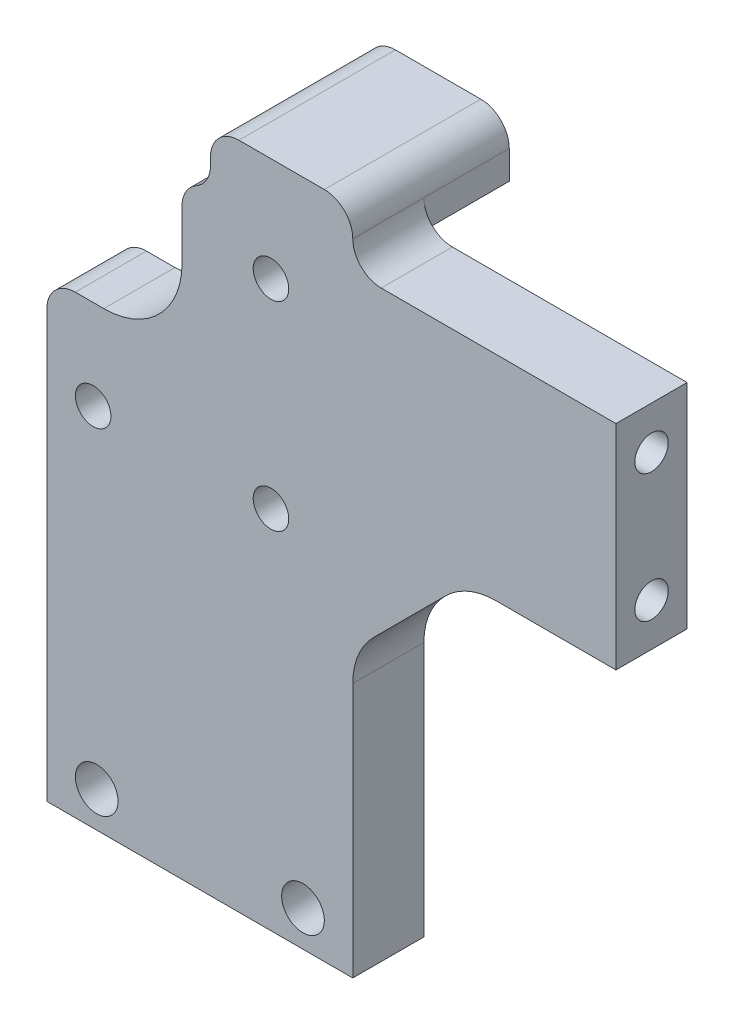
ISO-10303-21;
HEADER;
FILE_DESCRIPTION(('STEP AP214'),'2;1');
FILE_NAME('part.step','',(''),(''),'','','');
FILE_SCHEMA(('AUTOMOTIVE_DESIGN { 1 0 10303 214 1 1 1 1 }'));
ENDSEC;
DATA;
#1=APPLICATION_CONTEXT('core data for automotive mechanical design processes');
#2=APPLICATION_PROTOCOL_DEFINITION('international standard','automotive_design',2000,#1);
#3=PRODUCT_CONTEXT('',#1,'mechanical');
#4=PRODUCT('Part','Part','',(#3));
#5=PRODUCT_RELATED_PRODUCT_CATEGORY('part','',(#4));
#6=PRODUCT_DEFINITION_FORMATION('','',#4);
#7=PRODUCT_DEFINITION_CONTEXT('part definition',#1,'design');
#8=PRODUCT_DEFINITION('design','',#6,#7);
#9=PRODUCT_DEFINITION_SHAPE('','',#8);
#10=(LENGTH_UNIT() NAMED_UNIT(*) SI_UNIT(.MILLI.,.METRE.));
#11=(NAMED_UNIT(*) PLANE_ANGLE_UNIT() SI_UNIT($,.RADIAN.));
#12=(NAMED_UNIT(*) SI_UNIT($,.STERADIAN.) SOLID_ANGLE_UNIT());
#13=UNCERTAINTY_MEASURE_WITH_UNIT(LENGTH_MEASURE(1.E-05),#10,'distance_accuracy_value','');
#14=(GEOMETRIC_REPRESENTATION_CONTEXT(3) GLOBAL_UNCERTAINTY_ASSIGNED_CONTEXT((#13)) GLOBAL_UNIT_ASSIGNED_CONTEXT((#10,
#11,#12)) REPRESENTATION_CONTEXT('',''));
#15=CARTESIAN_POINT('',(0.,0.,0.));
#16=DIRECTION('',(0.,0.,1.));
#17=DIRECTION('',(1.,0.,0.));
#18=AXIS2_PLACEMENT_3D('',#15,#16,#17);
#19=CARTESIAN_POINT('',(5.,4.19457455546433,-0.00100000000000013));
#20=DIRECTION('',(0.,0.,1.));
#21=DIRECTION('',(1.,0.,0.));
#22=AXIS2_PLACEMENT_3D('',#19,#20,#21);
#23=CYLINDRICAL_SURFACE('',#22,1.25);
#24=CARTESIAN_POINT('',(5.,4.19457455546433,5.));
#25=DIRECTION('',(0.,0.,1.));
#26=DIRECTION('',(1.,0.,0.));
#27=AXIS2_PLACEMENT_3D('',#24,#25,#26);
#28=CIRCLE('',#27,1.25);
#29=CARTESIAN_POINT('',(6.25,4.19457455546433,5.));
#30=VERTEX_POINT('',#29);
#31=EDGE_CURVE('E286',#30,#30,#28,.T.);
#32=ORIENTED_EDGE('',*,*,#31,.T.);
#33=EDGE_LOOP('',(#32));
#34=FACE_BOUND('',#33,.T.);
#35=CARTESIAN_POINT('',(5.,4.19457455546433,2.));
#36=DIRECTION('',(0.,0.,-1.));
#37=DIRECTION('',(-1.,0.,0.));
#38=AXIS2_PLACEMENT_3D('',#35,#36,#37);
#39=CIRCLE('',#38,1.25);
#40=CARTESIAN_POINT('',(3.75,4.19457455546433,2.));
#41=VERTEX_POINT('',#40);
#42=EDGE_CURVE('E280',#41,#41,#39,.F.);
#43=ORIENTED_EDGE('',*,*,#42,.F.);
#44=EDGE_LOOP('',(#43));
#45=FACE_BOUND('',#44,.T.);
#46=ADVANCED_FACE('F42',(#34,#45),#23,.F.);
#47=CARTESIAN_POINT('',(-7.5,4.19457455546433,-0.00100000000000013));
#48=DIRECTION('',(0.,0.,1.));
#49=DIRECTION('',(1.,0.,0.));
#50=AXIS2_PLACEMENT_3D('',#47,#48,#49);
#51=CYLINDRICAL_SURFACE('',#50,1.25);
#52=CARTESIAN_POINT('',(-7.5,4.19457455546433,5.));
#53=DIRECTION('',(0.,0.,1.));
#54=DIRECTION('',(1.,0.,0.));
#55=AXIS2_PLACEMENT_3D('',#52,#53,#54);
#56=CIRCLE('',#55,1.25);
#57=CARTESIAN_POINT('',(-6.25,4.19457455546433,5.));
#58=VERTEX_POINT('',#57);
#59=EDGE_CURVE('E283',#58,#58,#56,.T.);
#60=ORIENTED_EDGE('',*,*,#59,.T.);
#61=EDGE_LOOP('',(#60));
#62=FACE_BOUND('',#61,.T.);
#63=CARTESIAN_POINT('',(-7.5,4.19457455546433,2.));
#64=DIRECTION('',(0.,0.,-1.));
#65=DIRECTION('',(-1.,0.,0.));
#66=AXIS2_PLACEMENT_3D('',#63,#64,#65);
#67=CIRCLE('',#66,1.25);
#68=CARTESIAN_POINT('',(-8.75,4.19457455546433,2.));
#69=VERTEX_POINT('',#68);
#70=EDGE_CURVE('E348',#69,#69,#67,.F.);
#71=ORIENTED_EDGE('',*,*,#70,.F.);
#72=EDGE_LOOP('',(#71));
#73=FACE_BOUND('',#72,.T.);
#74=ADVANCED_FACE('F525',(#62,#73),#51,.F.);
#75=CARTESIAN_POINT('',(5.,18.1945745554643,-0.00100000000000013));
#76=DIRECTION('',(0.,0.,1.));
#77=DIRECTION('',(1.,0.,0.));
#78=AXIS2_PLACEMENT_3D('',#75,#76,#77);
#79=CYLINDRICAL_SURFACE('',#78,1.25);
#80=CARTESIAN_POINT('',(5.,18.1945745554643,5.));
#81=DIRECTION('',(0.,0.,1.));
#82=DIRECTION('',(1.,0.,0.));
#83=AXIS2_PLACEMENT_3D('',#80,#81,#82);
#84=CIRCLE('',#83,1.25);
#85=CARTESIAN_POINT('',(6.25,18.1945745554643,5.));
#86=VERTEX_POINT('',#85);
#87=EDGE_CURVE('E276',#86,#86,#84,.T.);
#88=ORIENTED_EDGE('',*,*,#87,.T.);
#89=EDGE_LOOP('',(#88));
#90=FACE_BOUND('',#89,.T.);
#91=CARTESIAN_POINT('',(5.,18.1945745554643,2.));
#92=DIRECTION('',(0.,0.,-1.));
#93=DIRECTION('',(-1.,0.,0.));
#94=AXIS2_PLACEMENT_3D('',#91,#92,#93);
#95=CIRCLE('',#94,1.25);
#96=CARTESIAN_POINT('',(3.75,18.1945745554643,2.));
#97=VERTEX_POINT('',#96);
#98=EDGE_CURVE('E266',#97,#97,#95,.F.);
#99=ORIENTED_EDGE('',*,*,#98,.F.);
#100=EDGE_LOOP('',(#99));
#101=FACE_BOUND('',#100,.T.);
#102=ADVANCED_FACE('F531',(#90,#101),#79,.F.);
#103=CARTESIAN_POINT('',(10.75,21.5,5.));
#104=DIRECTION('',(-1.,0.,0.));
#105=DIRECTION('',(0.,-1.,0.));
#106=AXIS2_PLACEMENT_3D('',#103,#104,#105);
#107=PLANE('',#106);
#108=DIRECTION('',(0.,1.,0.));
#109=VECTOR('',#108,1.);
#110=CARTESIAN_POINT('',(10.75,21.5,0.));
#111=LINE('',#110,#109);
#112=CARTESIAN_POINT('',(10.75,-21.5,0.));
#113=VERTEX_POINT('',#112);
#114=CARTESIAN_POINT('',(10.75,-3.57106781186552,0.));
#115=VERTEX_POINT('',#114);
#116=EDGE_CURVE('E317',#113,#115,#111,.T.);
#117=ORIENTED_EDGE('',*,*,#116,.T.);
#118=DIRECTION('',(0.,0.,1.));
#119=VECTOR('',#118,1.);
#120=CARTESIAN_POINT('',(10.75,-3.57106781186552,5.));
#121=LINE('',#120,#119);
#122=CARTESIAN_POINT('',(10.75,-3.57106781186552,5.));
#123=VERTEX_POINT('',#122);
#124=EDGE_CURVE('E381',#115,#123,#121,.T.);
#125=ORIENTED_EDGE('',*,*,#124,.T.);
#126=DIRECTION('',(0.,1.,0.));
#127=VECTOR('',#126,1.);
#128=CARTESIAN_POINT('',(10.75,21.5,5.));
#129=LINE('',#128,#127);
#130=CARTESIAN_POINT('',(10.75,-21.5,5.));
#131=VERTEX_POINT('',#130);
#132=EDGE_CURVE('E320',#131,#123,#129,.T.);
#133=ORIENTED_EDGE('',*,*,#132,.F.);
#134=DIRECTION('',(0.,0.,-1.));
#135=VECTOR('',#134,1.);
#136=CARTESIAN_POINT('',(10.75,-21.5,5.));
#137=LINE('',#136,#135);
#138=EDGE_CURVE('E331',#131,#113,#137,.T.);
#139=ORIENTED_EDGE('',*,*,#138,.T.);
#140=EDGE_LOOP('',(#117,#125,#133,#139));
#141=FACE_BOUND('',#140,.T.);
#142=ADVANCED_FACE('F469',(#141),#107,.F.);
#143=CARTESIAN_POINT('',(-10.75,21.5,5.));
#144=DIRECTION('',(0.,-1.,0.));
#145=DIRECTION('',(0.,0.,-1.));
#146=AXIS2_PLACEMENT_3D('',#143,#144,#145);
#147=PLANE('',#146);
#148=DIRECTION('',(-1.,0.,0.));
#149=VECTOR('',#148,1.);
#150=CARTESIAN_POINT('',(-10.75,21.5,0.));
#151=LINE('',#150,#149);
#152=CARTESIAN_POINT('',(29.25,21.5,0.));
#153=VERTEX_POINT('',#152);
#154=CARTESIAN_POINT('',(12.75,21.5,0.));
#155=VERTEX_POINT('',#154);
#156=EDGE_CURVE('E334',#153,#155,#151,.T.);
#157=ORIENTED_EDGE('',*,*,#156,.T.);
#158=DIRECTION('',(0.,0.,1.));
#159=VECTOR('',#158,1.);
#160=CARTESIAN_POINT('',(12.75,21.5,5.));
#161=LINE('',#160,#159);
#162=CARTESIAN_POINT('',(12.75,21.5,5.));
#163=VERTEX_POINT('',#162);
#164=EDGE_CURVE('E399',#155,#163,#161,.T.);
#165=ORIENTED_EDGE('',*,*,#164,.T.);
#166=DIRECTION('',(-1.,0.,0.));
#167=VECTOR('',#166,1.);
#168=CARTESIAN_POINT('',(-10.75,21.5,5.));
#169=LINE('',#168,#167);
#170=CARTESIAN_POINT('',(29.25,21.5,5.));
#171=VERTEX_POINT('',#170);
#172=EDGE_CURVE('E323',#171,#163,#169,.T.);
#173=ORIENTED_EDGE('',*,*,#172,.F.);
#174=DIRECTION('',(0.,0.,1.));
#175=VECTOR('',#174,1.);
#176=CARTESIAN_POINT('',(29.25,21.5,0.));
#177=LINE('',#176,#175);
#178=EDGE_CURVE('E314',#153,#171,#177,.T.);
#179=ORIENTED_EDGE('',*,*,#178,.F.);
#180=EDGE_LOOP('',(#157,#165,#173,#179));
#181=FACE_BOUND('',#180,.T.);
#182=ADVANCED_FACE('F444',(#181),#147,.F.);
#183=CARTESIAN_POINT('',(-10.75,21.5,5.));
#184=DIRECTION('',(1.,0.,0.));
#185=DIRECTION('',(0.,1.,0.));
#186=AXIS2_PLACEMENT_3D('',#183,#184,#185);
#187=PLANE('',#186);
#188=DIRECTION('',(0.,-1.,0.));
#189=VECTOR('',#188,1.);
#190=CARTESIAN_POINT('',(-10.75,21.5,5.));
#191=LINE('',#190,#189);
#192=CARTESIAN_POINT('',(-10.75,8.49999999999999,5.));
#193=VERTEX_POINT('',#192);
#194=CARTESIAN_POINT('',(-10.75,-21.5,5.));
#195=VERTEX_POINT('',#194);
#196=EDGE_CURVE('E327',#193,#195,#191,.T.);
#197=ORIENTED_EDGE('',*,*,#196,.F.);
#198=DIRECTION('',(0.,0.,1.));
#199=VECTOR('',#198,1.);
#200=CARTESIAN_POINT('',(-10.75,8.49999999999999,5.));
#201=LINE('',#200,#199);
#202=CARTESIAN_POINT('',(-10.75,8.49999999999999,0.));
#203=VERTEX_POINT('',#202);
#204=EDGE_CURVE('E372',#193,#203,#201,.F.);
#205=ORIENTED_EDGE('',*,*,#204,.T.);
#206=DIRECTION('',(0.,-1.,0.));
#207=VECTOR('',#206,1.);
#208=CARTESIAN_POINT('',(-10.75,21.5,0.));
#209=LINE('',#208,#207);
#210=CARTESIAN_POINT('',(-10.75,-21.5,0.));
#211=VERTEX_POINT('',#210);
#212=EDGE_CURVE('E337',#203,#211,#209,.T.);
#213=ORIENTED_EDGE('',*,*,#212,.T.);
#214=DIRECTION('',(0.,0.,-1.));
#215=VECTOR('',#214,1.);
#216=CARTESIAN_POINT('',(-10.75,-21.5,5.));
#217=LINE('',#216,#215);
#218=EDGE_CURVE('E342',#195,#211,#217,.T.);
#219=ORIENTED_EDGE('',*,*,#218,.F.);
#220=EDGE_LOOP('',(#197,#205,#213,#219));
#221=FACE_BOUND('',#220,.T.);
#222=ADVANCED_FACE('F481',(#221),#187,.F.);
#223=CARTESIAN_POINT('',(-10.75,-21.5,5.));
#224=DIRECTION('',(0.,1.,0.));
#225=DIRECTION('',(0.,0.,1.));
#226=AXIS2_PLACEMENT_3D('',#223,#224,#225);
#227=PLANE('',#226);
#228=DIRECTION('',(1.,0.,0.));
#229=VECTOR('',#228,1.);
#230=CARTESIAN_POINT('',(-10.75,-21.5,0.));
#231=LINE('',#230,#229);
#232=EDGE_CURVE('E324',#211,#113,#231,.T.);
#233=ORIENTED_EDGE('',*,*,#232,.T.);
#234=ORIENTED_EDGE('',*,*,#138,.F.);
#235=DIRECTION('',(1.,0.,0.));
#236=VECTOR('',#235,1.);
#237=CARTESIAN_POINT('',(-10.75,-21.5,5.));
#238=LINE('',#237,#236);
#239=EDGE_CURVE('E329',#195,#131,#238,.T.);
#240=ORIENTED_EDGE('',*,*,#239,.F.);
#241=ORIENTED_EDGE('',*,*,#218,.T.);
#242=EDGE_LOOP('',(#233,#234,#240,#241));
#243=FACE_BOUND('',#242,.T.);
#244=ADVANCED_FACE('F476',(#243),#227,.F.);
#245=CARTESIAN_POINT('',(0.,0.,5.));
#246=DIRECTION('',(0.,0.,1.));
#247=DIRECTION('',(1.,0.,0.));
#248=AXIS2_PLACEMENT_3D('',#245,#246,#247);
#249=PLANE('',#248);
#250=ORIENTED_EDGE('',*,*,#172,.T.);
#251=CARTESIAN_POINT('',(12.75,23.5,5.));
#252=DIRECTION('',(0.,0.,1.));
#253=DIRECTION('',(1.,0.,0.));
#254=AXIS2_PLACEMENT_3D('',#251,#252,#253);
#255=CIRCLE('',#254,2.);
#256=CARTESIAN_POINT('',(10.75,23.5,5.));
#257=VERTEX_POINT('',#256);
#258=EDGE_CURVE('E51',#163,#257,#255,.F.);
#259=ORIENTED_EDGE('',*,*,#258,.T.);
#260=CARTESIAN_POINT('',(8.75,23.5,5.));
#261=DIRECTION('',(0.,0.,1.));
#262=DIRECTION('',(1.,0.,0.));
#263=AXIS2_PLACEMENT_3D('',#260,#261,#262);
#264=CIRCLE('',#263,2.);
#265=CARTESIAN_POINT('',(8.75,25.5,5.));
#266=VERTEX_POINT('',#265);
#267=EDGE_CURVE('E409',#257,#266,#264,.T.);
#268=ORIENTED_EDGE('',*,*,#267,.T.);
#269=DIRECTION('',(-1.,0.,0.));
#270=VECTOR('',#269,1.);
#271=CARTESIAN_POINT('',(0.749999999999999,25.5,5.));
#272=LINE('',#271,#270);
#273=CARTESIAN_POINT('',(2.75,25.5,5.));
#274=VERTEX_POINT('',#273);
#275=EDGE_CURVE('E205',#266,#274,#272,.T.);
#276=ORIENTED_EDGE('',*,*,#275,.T.);
#277=CARTESIAN_POINT('',(2.75,23.5,5.));
#278=DIRECTION('',(0.,0.,1.));
#279=DIRECTION('',(1.,0.,0.));
#280=AXIS2_PLACEMENT_3D('',#277,#278,#279);
#281=CIRCLE('',#280,2.);
#282=CARTESIAN_POINT('',(0.749999999999999,23.5,5.));
#283=VERTEX_POINT('',#282);
#284=EDGE_CURVE('E407',#274,#283,#281,.T.);
#285=ORIENTED_EDGE('',*,*,#284,.T.);
#286=DIRECTION('',(0.,-1.,0.));
#287=VECTOR('',#286,1.);
#288=CARTESIAN_POINT('',(0.749999999999999,21.5,5.));
#289=LINE('',#288,#287);
#290=CARTESIAN_POINT('',(0.749999999999999,22.9641016151377,5.));
#291=VERTEX_POINT('',#290);
#292=EDGE_CURVE('E223',#283,#291,#289,.T.);
#293=ORIENTED_EDGE('',*,*,#292,.T.);
#294=CARTESIAN_POINT('',(-1.25,22.9641016151377,5.));
#295=DIRECTION('',(0.,0.,1.));
#296=DIRECTION('',(1.,0.,0.));
#297=AXIS2_PLACEMENT_3D('',#294,#295,#296);
#298=CIRCLE('',#297,2.);
#299=CARTESIAN_POINT('',(-0.25,21.2320508075689,5.));
#300=VERTEX_POINT('',#299);
#301=EDGE_CURVE('E419',#291,#300,#298,.F.);
#302=ORIENTED_EDGE('',*,*,#301,.T.);
#303=CARTESIAN_POINT('',(0.749999999999999,19.5,5.));
#304=DIRECTION('',(0.,0.,1.));
#305=DIRECTION('',(1.,0.,0.));
#306=AXIS2_PLACEMENT_3D('',#303,#304,#305);
#307=CIRCLE('',#306,2.);
#308=CARTESIAN_POINT('',(-1.25,19.5,5.));
#309=VERTEX_POINT('',#308);
#310=EDGE_CURVE('E360',#300,#309,#307,.T.);
#311=ORIENTED_EDGE('',*,*,#310,.T.);
#312=DIRECTION('',(0.,1.,0.));
#313=VECTOR('',#312,1.);
#314=CARTESIAN_POINT('',(-1.25,21.5,5.));
#315=LINE('',#314,#313);
#316=CARTESIAN_POINT('',(-1.25,16.,5.));
#317=VERTEX_POINT('',#316);
#318=EDGE_CURVE('E242',#317,#309,#315,.T.);
#319=ORIENTED_EDGE('',*,*,#318,.F.);
#320=CARTESIAN_POINT('',(-6.75,16.,5.));
#321=DIRECTION('',(0.,0.,1.));
#322=DIRECTION('',(1.,0.,0.));
#323=AXIS2_PLACEMENT_3D('',#320,#321,#322);
#324=CIRCLE('',#323,5.5);
#325=CARTESIAN_POINT('',(-6.75,10.5,5.));
#326=VERTEX_POINT('',#325);
#327=EDGE_CURVE('E239',#326,#317,#324,.T.);
#328=ORIENTED_EDGE('',*,*,#327,.F.);
#329=DIRECTION('',(1.,0.,0.));
#330=VECTOR('',#329,1.);
#331=CARTESIAN_POINT('',(-10.75,10.5,5.));
#332=LINE('',#331,#330);
#333=CARTESIAN_POINT('',(-8.75,10.5,5.));
#334=VERTEX_POINT('',#333);
#335=EDGE_CURVE('E237',#334,#326,#332,.T.);
#336=ORIENTED_EDGE('',*,*,#335,.F.);
#337=CARTESIAN_POINT('',(-8.75,8.49999999999999,5.));
#338=DIRECTION('',(0.,0.,1.));
#339=DIRECTION('',(1.,0.,0.));
#340=AXIS2_PLACEMENT_3D('',#337,#338,#339);
#341=CIRCLE('',#340,2.);
#342=EDGE_CURVE('E358',#334,#193,#341,.T.);
#343=ORIENTED_EDGE('',*,*,#342,.T.);
#344=ORIENTED_EDGE('',*,*,#196,.T.);
#345=ORIENTED_EDGE('',*,*,#239,.T.);
#346=ORIENTED_EDGE('',*,*,#132,.T.);
#347=CARTESIAN_POINT('',(15.75,-3.57106781186552,5.));
#348=DIRECTION('',(0.,0.,1.));
#349=DIRECTION('',(1.,0.,0.));
#350=AXIS2_PLACEMENT_3D('',#347,#348,#349);
#351=CIRCLE('',#350,5.);
#352=CARTESIAN_POINT('',(12.2144660940672,-0.0355339059327985,5.));
#353=VERTEX_POINT('',#352);
#354=EDGE_CURVE('E388',#123,#353,#351,.F.);
#355=ORIENTED_EDGE('',*,*,#354,.T.);
#356=DIRECTION('',(0.707106781186543,0.707106781186552,0.));
#357=VECTOR('',#356,1.);
#358=CARTESIAN_POINT('',(10.75,-1.50000000000006,5.));
#359=LINE('',#358,#357);
#360=CARTESIAN_POINT('',(17.2855339059327,5.03553390593271,5.));
#361=VERTEX_POINT('',#360);
#362=EDGE_CURVE('E345',#353,#361,#359,.T.);
#363=ORIENTED_EDGE('',*,*,#362,.T.);
#364=CARTESIAN_POINT('',(20.8210678118655,1.49999999999999,5.));
#365=DIRECTION('',(0.,0.,1.));
#366=DIRECTION('',(1.,0.,0.));
#367=AXIS2_PLACEMENT_3D('',#364,#365,#366);
#368=CIRCLE('',#367,5.);
#369=CARTESIAN_POINT('',(20.8210678118655,6.49999999999999,5.));
#370=VERTEX_POINT('',#369);
#371=EDGE_CURVE('E386',#361,#370,#368,.F.);
#372=ORIENTED_EDGE('',*,*,#371,.T.);
#373=DIRECTION('',(1.,0.,0.));
#374=VECTOR('',#373,1.);
#375=CARTESIAN_POINT('',(29.25,6.49999999999999,5.));
#376=LINE('',#375,#374);
#377=CARTESIAN_POINT('',(29.25,6.49999999999999,5.));
#378=VERTEX_POINT('',#377);
#379=EDGE_CURVE('E295',#370,#378,#376,.T.);
#380=ORIENTED_EDGE('',*,*,#379,.T.);
#381=DIRECTION('',(0.,1.,0.));
#382=VECTOR('',#381,1.);
#383=CARTESIAN_POINT('',(29.25,21.5,5.));
#384=LINE('',#383,#382);
#385=EDGE_CURVE('E307',#378,#171,#384,.T.);
#386=ORIENTED_EDGE('',*,*,#385,.T.);
#387=EDGE_LOOP('',(#250,#259,#268,#276,#285,#293,#302,#311,#319,#328,#336,#343,#344,#345,#346,
#355,#363,#372,#380,#386));
#388=FACE_BOUND('',#387,.T.);
#389=CARTESIAN_POINT('',(-7.25,-19.,5.));
#390=DIRECTION('',(0.,0.,1.));
#391=DIRECTION('',(1.,0.,0.));
#392=AXIS2_PLACEMENT_3D('',#389,#390,#391);
#393=CIRCLE('',#392,1.5);
#394=CARTESIAN_POINT('',(-5.75,-19.,5.));
#395=VERTEX_POINT('',#394);
#396=EDGE_CURVE('E269',#395,#395,#393,.T.);
#397=ORIENTED_EDGE('',*,*,#396,.F.);
#398=EDGE_LOOP('',(#397));
#399=FACE_BOUND('',#398,.T.);
#400=CARTESIAN_POINT('',(7.25000000000001,-19.,5.));
#401=DIRECTION('',(0.,0.,1.));
#402=DIRECTION('',(1.,0.,0.));
#403=AXIS2_PLACEMENT_3D('',#400,#401,#402);
#404=CIRCLE('',#403,1.5);
#405=CARTESIAN_POINT('',(8.75000000000001,-19.,5.));
#406=VERTEX_POINT('',#405);
#407=EDGE_CURVE('E277',#406,#406,#404,.T.);
#408=ORIENTED_EDGE('',*,*,#407,.F.);
#409=EDGE_LOOP('',(#408));
#410=FACE_BOUND('',#409,.T.);
#411=ORIENTED_EDGE('',*,*,#87,.F.);
#412=EDGE_LOOP('',(#411));
#413=FACE_BOUND('',#412,.T.);
#414=ORIENTED_EDGE('',*,*,#59,.F.);
#415=EDGE_LOOP('',(#414));
#416=FACE_BOUND('',#415,.T.);
#417=ORIENTED_EDGE('',*,*,#31,.F.);
#418=EDGE_LOOP('',(#417));
#419=FACE_BOUND('',#418,.T.);
#420=ADVANCED_FACE('F425',(#388,#399,#410,#413,#416,#419),#249,.T.);
#421=CARTESIAN_POINT('',(0.,0.,0.));
#422=DIRECTION('',(0.,0.,1.));
#423=DIRECTION('',(1.,0.,0.));
#424=AXIS2_PLACEMENT_3D('',#421,#422,#423);
#425=PLANE('',#424);
#426=CARTESIAN_POINT('',(-7.5,4.19457455546433,0.));
#427=DIRECTION('',(0.,0.,-1.));
#428=DIRECTION('',(-1.,0.,0.));
#429=AXIS2_PLACEMENT_3D('',#426,#427,#428);
#430=CIRCLE('',#429,2.25);
#431=CARTESIAN_POINT('',(-9.75,4.19457455546433,0.));
#432=VERTEX_POINT('',#431);
#433=EDGE_CURVE('E248',#432,#432,#430,.T.);
#434=ORIENTED_EDGE('',*,*,#433,.F.);
#435=EDGE_LOOP('',(#434));
#436=FACE_BOUND('',#435,.T.);
#437=CARTESIAN_POINT('',(5.,18.1945745554643,0.));
#438=DIRECTION('',(0.,0.,-1.));
#439=DIRECTION('',(-1.,0.,0.));
#440=AXIS2_PLACEMENT_3D('',#437,#438,#439);
#441=CIRCLE('',#440,2.25);
#442=CARTESIAN_POINT('',(2.75,18.1945745554643,0.));
#443=VERTEX_POINT('',#442);
#444=EDGE_CURVE('E255',#443,#443,#441,.T.);
#445=ORIENTED_EDGE('',*,*,#444,.F.);
#446=EDGE_LOOP('',(#445));
#447=FACE_BOUND('',#446,.T.);
#448=CARTESIAN_POINT('',(5.,4.19457455546433,0.));
#449=DIRECTION('',(0.,0.,-1.));
#450=DIRECTION('',(-1.,0.,0.));
#451=AXIS2_PLACEMENT_3D('',#448,#449,#450);
#452=CIRCLE('',#451,2.25);
#453=CARTESIAN_POINT('',(2.75,4.19457455546433,0.));
#454=VERTEX_POINT('',#453);
#455=EDGE_CURVE('E254',#454,#454,#452,.T.);
#456=ORIENTED_EDGE('',*,*,#455,.F.);
#457=EDGE_LOOP('',(#456));
#458=FACE_BOUND('',#457,.T.);
#459=CARTESIAN_POINT('',(-7.25,-19.,0.));
#460=DIRECTION('',(0.,0.,1.));
#461=DIRECTION('',(1.,0.,0.));
#462=AXIS2_PLACEMENT_3D('',#459,#460,#461);
#463=CIRCLE('',#462,1.5);
#464=CARTESIAN_POINT('',(-5.75,-19.,0.));
#465=VERTEX_POINT('',#464);
#466=EDGE_CURVE('E272',#465,#465,#463,.F.);
#467=ORIENTED_EDGE('',*,*,#466,.F.);
#468=EDGE_LOOP('',(#467));
#469=FACE_BOUND('',#468,.T.);
#470=CARTESIAN_POINT('',(7.25000000000001,-19.,0.));
#471=DIRECTION('',(0.,0.,1.));
#472=DIRECTION('',(1.,0.,0.));
#473=AXIS2_PLACEMENT_3D('',#470,#471,#472);
#474=CIRCLE('',#473,1.5);
#475=CARTESIAN_POINT('',(8.75000000000001,-19.,0.));
#476=VERTEX_POINT('',#475);
#477=EDGE_CURVE('E273',#476,#476,#474,.F.);
#478=ORIENTED_EDGE('',*,*,#477,.F.);
#479=EDGE_LOOP('',(#478));
#480=FACE_BOUND('',#479,.T.);
#481=DIRECTION('',(0.,-1.,0.));
#482=VECTOR('',#481,1.);
#483=CARTESIAN_POINT('',(-1.25,21.5,0.));
#484=LINE('',#483,#482);
#485=CARTESIAN_POINT('',(-1.25,19.5,0.));
#486=VERTEX_POINT('',#485);
#487=CARTESIAN_POINT('',(-1.25,16.,0.));
#488=VERTEX_POINT('',#487);
#489=EDGE_CURVE('E235',#486,#488,#484,.T.);
#490=ORIENTED_EDGE('',*,*,#489,.F.);
#491=CARTESIAN_POINT('',(0.749999999999999,19.5,0.));
#492=DIRECTION('',(0.,0.,1.));
#493=DIRECTION('',(1.,0.,0.));
#494=AXIS2_PLACEMENT_3D('',#491,#492,#493);
#495=CIRCLE('',#494,2.);
#496=CARTESIAN_POINT('',(-0.25,21.2320508075689,0.));
#497=VERTEX_POINT('',#496);
#498=EDGE_CURVE('E366',#486,#497,#495,.F.);
#499=ORIENTED_EDGE('',*,*,#498,.T.);
#500=CARTESIAN_POINT('',(-1.25,22.9641016151377,0.));
#501=DIRECTION('',(0.,0.,1.));
#502=DIRECTION('',(1.,0.,0.));
#503=AXIS2_PLACEMENT_3D('',#500,#501,#502);
#504=CIRCLE('',#503,2.);
#505=CARTESIAN_POINT('',(0.749999999999999,22.9641016151377,0.));
#506=VERTEX_POINT('',#505);
#507=EDGE_CURVE('E421',#497,#506,#504,.T.);
#508=ORIENTED_EDGE('',*,*,#507,.T.);
#509=DIRECTION('',(0.,1.,0.));
#510=VECTOR('',#509,1.);
#511=CARTESIAN_POINT('',(0.749999999999999,21.5,0.));
#512=LINE('',#511,#510);
#513=CARTESIAN_POINT('',(0.749999999999999,21.5,0.));
#514=VERTEX_POINT('',#513);
#515=EDGE_CURVE('E58',#514,#506,#512,.T.);
#516=ORIENTED_EDGE('',*,*,#515,.F.);
#517=DIRECTION('',(1.,0.,0.));
#518=VECTOR('',#517,1.);
#519=CARTESIAN_POINT('',(0.,21.5,0.));
#520=LINE('',#519,#518);
#521=CARTESIAN_POINT('',(10.75,21.5,0.));
#522=VERTEX_POINT('',#521);
#523=EDGE_CURVE('E211',#514,#522,#520,.T.);
#524=ORIENTED_EDGE('',*,*,#523,.T.);
#525=DIRECTION('',(0.,-1.,0.));
#526=VECTOR('',#525,1.);
#527=CARTESIAN_POINT('',(10.75,21.5,0.));
#528=LINE('',#527,#526);
#529=CARTESIAN_POINT('',(10.75,23.5,0.));
#530=VERTEX_POINT('',#529);
#531=EDGE_CURVE('E405',#530,#522,#528,.T.);
#532=ORIENTED_EDGE('',*,*,#531,.F.);
#533=CARTESIAN_POINT('',(12.75,23.5,0.));
#534=DIRECTION('',(0.,0.,1.));
#535=DIRECTION('',(1.,0.,0.));
#536=AXIS2_PLACEMENT_3D('',#533,#534,#535);
#537=CIRCLE('',#536,2.);
#538=EDGE_CURVE('E11',#530,#155,#537,.T.);
#539=ORIENTED_EDGE('',*,*,#538,.T.);
#540=ORIENTED_EDGE('',*,*,#156,.F.);
#541=DIRECTION('',(0.,1.,0.));
#542=VECTOR('',#541,1.);
#543=CARTESIAN_POINT('',(29.25,21.5,0.));
#544=LINE('',#543,#542);
#545=CARTESIAN_POINT('',(29.25,6.49999999999999,0.));
#546=VERTEX_POINT('',#545);
#547=EDGE_CURVE('E306',#546,#153,#544,.T.);
#548=ORIENTED_EDGE('',*,*,#547,.F.);
#549=DIRECTION('',(1.,0.,0.));
#550=VECTOR('',#549,1.);
#551=CARTESIAN_POINT('',(29.25,6.49999999999999,0.));
#552=LINE('',#551,#550);
#553=CARTESIAN_POINT('',(20.8210678118655,6.49999999999999,0.));
#554=VERTEX_POINT('',#553);
#555=EDGE_CURVE('E304',#554,#546,#552,.T.);
#556=ORIENTED_EDGE('',*,*,#555,.F.);
#557=CARTESIAN_POINT('',(20.8210678118655,1.49999999999999,0.));
#558=DIRECTION('',(0.,0.,1.));
#559=DIRECTION('',(1.,0.,0.));
#560=AXIS2_PLACEMENT_3D('',#557,#558,#559);
#561=CIRCLE('',#560,5.);
#562=CARTESIAN_POINT('',(17.2855339059327,5.03553390593271,0.));
#563=VERTEX_POINT('',#562);
#564=EDGE_CURVE('E384',#554,#563,#561,.T.);
#565=ORIENTED_EDGE('',*,*,#564,.T.);
#566=DIRECTION('',(-0.707106781186543,-0.707106781186552,0.));
#567=VECTOR('',#566,1.);
#568=CARTESIAN_POINT('',(6.12500000000009,-6.12500000000002,0.));
#569=LINE('',#568,#567);
#570=CARTESIAN_POINT('',(12.2144660940672,-0.0355339059327983,0.));
#571=VERTEX_POINT('',#570);
#572=EDGE_CURVE('E355',#563,#571,#569,.T.);
#573=ORIENTED_EDGE('',*,*,#572,.T.);
#574=CARTESIAN_POINT('',(15.75,-3.57106781186552,0.));
#575=DIRECTION('',(0.,0.,1.));
#576=DIRECTION('',(1.,0.,0.));
#577=AXIS2_PLACEMENT_3D('',#574,#575,#576);
#578=CIRCLE('',#577,5.);
#579=EDGE_CURVE('E390',#571,#115,#578,.T.);
#580=ORIENTED_EDGE('',*,*,#579,.T.);
#581=ORIENTED_EDGE('',*,*,#116,.F.);
#582=ORIENTED_EDGE('',*,*,#232,.F.);
#583=ORIENTED_EDGE('',*,*,#212,.F.);
#584=CARTESIAN_POINT('',(-8.75,8.49999999999999,0.));
#585=DIRECTION('',(0.,0.,1.));
#586=DIRECTION('',(1.,0.,0.));
#587=AXIS2_PLACEMENT_3D('',#584,#585,#586);
#588=CIRCLE('',#587,2.);
#589=CARTESIAN_POINT('',(-8.75,10.5,0.));
#590=VERTEX_POINT('',#589);
#591=EDGE_CURVE('E364',#203,#590,#588,.F.);
#592=ORIENTED_EDGE('',*,*,#591,.T.);
#593=DIRECTION('',(-1.,0.,0.));
#594=VECTOR('',#593,1.);
#595=CARTESIAN_POINT('',(-10.75,10.5,0.));
#596=LINE('',#595,#594);
#597=CARTESIAN_POINT('',(-6.75,10.5,0.));
#598=VERTEX_POINT('',#597);
#599=EDGE_CURVE('E230',#598,#590,#596,.T.);
#600=ORIENTED_EDGE('',*,*,#599,.F.);
#601=CARTESIAN_POINT('',(-6.75,16.,0.));
#602=DIRECTION('',(0.,0.,1.));
#603=DIRECTION('',(1.,0.,0.));
#604=AXIS2_PLACEMENT_3D('',#601,#602,#603);
#605=CIRCLE('',#604,5.5);
#606=EDGE_CURVE('E233',#488,#598,#605,.F.);
#607=ORIENTED_EDGE('',*,*,#606,.F.);
#608=EDGE_LOOP('',(#490,#499,#508,#516,#524,#532,#539,#540,#548,#556,#565,#573,#580,#581,#582,
#583,#592,#600,#607));
#609=FACE_BOUND('',#608,.T.);
#610=ADVANCED_FACE('F440',(#436,#447,#458,#469,#480,#609),#425,.F.);
#611=CARTESIAN_POINT('',(29.25,21.5,0.));
#612=DIRECTION('',(1.,0.,0.));
#613=DIRECTION('',(0.,1.,0.));
#614=AXIS2_PLACEMENT_3D('',#611,#612,#613);
#615=PLANE('',#614);
#616=CARTESIAN_POINT('',(29.25,9.49999999999999,2.5));
#617=DIRECTION('',(1.,0.,0.));
#618=DIRECTION('',(0.,0.,-1.));
#619=AXIS2_PLACEMENT_3D('',#616,#617,#618);
#620=CIRCLE('',#619,1.175);
#621=CARTESIAN_POINT('',(29.25,9.49999999999999,1.325));
#622=VERTEX_POINT('',#621);
#623=EDGE_CURVE('E296',#622,#622,#620,.T.);
#624=ORIENTED_EDGE('',*,*,#623,.F.);
#625=EDGE_LOOP('',(#624));
#626=FACE_BOUND('',#625,.T.);
#627=CARTESIAN_POINT('',(29.25,18.5,2.5));
#628=DIRECTION('',(1.,0.,0.));
#629=DIRECTION('',(0.,0.,-1.));
#630=AXIS2_PLACEMENT_3D('',#627,#628,#629);
#631=CIRCLE('',#630,1.175);
#632=CARTESIAN_POINT('',(29.25,18.5,1.325));
#633=VERTEX_POINT('',#632);
#634=EDGE_CURVE('E291',#633,#633,#631,.T.);
#635=ORIENTED_EDGE('',*,*,#634,.F.);
#636=EDGE_LOOP('',(#635));
#637=FACE_BOUND('',#636,.T.);
#638=ORIENTED_EDGE('',*,*,#385,.F.);
#639=DIRECTION('',(0.,0.,1.));
#640=VECTOR('',#639,1.);
#641=CARTESIAN_POINT('',(29.25,6.49999999999999,0.));
#642=LINE('',#641,#640);
#643=EDGE_CURVE('E310',#546,#378,#642,.T.);
#644=ORIENTED_EDGE('',*,*,#643,.F.);
#645=ORIENTED_EDGE('',*,*,#547,.T.);
#646=ORIENTED_EDGE('',*,*,#178,.T.);
#647=EDGE_LOOP('',(#638,#644,#645,#646));
#648=FACE_BOUND('',#647,.T.);
#649=ADVANCED_FACE('F448',(#626,#637,#648),#615,.T.);
#650=CARTESIAN_POINT('',(29.25,6.49999999999999,0.));
#651=DIRECTION('',(0.,-1.,0.));
#652=DIRECTION('',(1.,0.,0.));
#653=AXIS2_PLACEMENT_3D('',#650,#651,#652);
#654=PLANE('',#653);
#655=ORIENTED_EDGE('',*,*,#379,.F.);
#656=DIRECTION('',(0.,0.,-1.));
#657=VECTOR('',#656,1.);
#658=CARTESIAN_POINT('',(20.8210678118655,6.49999999999999,0.));
#659=LINE('',#658,#657);
#660=EDGE_CURVE('E374',#370,#554,#659,.T.);
#661=ORIENTED_EDGE('',*,*,#660,.T.);
#662=ORIENTED_EDGE('',*,*,#555,.T.);
#663=ORIENTED_EDGE('',*,*,#643,.T.);
#664=EDGE_LOOP('',(#655,#661,#662,#663));
#665=FACE_BOUND('',#664,.T.);
#666=ADVANCED_FACE('F453',(#665),#654,.T.);
#667=CARTESIAN_POINT('',(21.25,18.5,2.5));
#668=DIRECTION('',(1.,0.,0.));
#669=DIRECTION('',(0.,0.,-1.));
#670=AXIS2_PLACEMENT_3D('',#667,#668,#669);
#671=CYLINDRICAL_SURFACE('',#670,1.175);
#672=CARTESIAN_POINT('',(21.25,18.5,2.5));
#673=DIRECTION('',(1.,0.,0.));
#674=DIRECTION('',(0.,0.,-1.));
#675=AXIS2_PLACEMENT_3D('',#672,#673,#674);
#676=CIRCLE('',#675,1.175);
#677=CARTESIAN_POINT('',(21.25,18.5,1.325));
#678=VERTEX_POINT('',#677);
#679=EDGE_CURVE('E299',#678,#678,#676,.T.);
#680=ORIENTED_EDGE('',*,*,#679,.F.);
#681=EDGE_LOOP('',(#680));
#682=FACE_BOUND('',#681,.T.);
#683=ORIENTED_EDGE('',*,*,#634,.T.);
#684=EDGE_LOOP('',(#683));
#685=FACE_BOUND('',#684,.T.);
#686=ADVANCED_FACE('F549',(#682,#685),#671,.F.);
#687=CARTESIAN_POINT('',(21.25,18.5,2.5));
#688=DIRECTION('',(1.,0.,0.));
#689=DIRECTION('',(0.,0.,-1.));
#690=AXIS2_PLACEMENT_3D('',#687,#688,#689);
#691=PLANE('',#690);
#692=ORIENTED_EDGE('',*,*,#679,.T.);
#693=EDGE_LOOP('',(#692));
#694=FACE_BOUND('',#693,.T.);
#695=ADVANCED_FACE('F545',(#694),#691,.T.);
#696=CARTESIAN_POINT('',(21.25,9.49999999999999,2.5));
#697=DIRECTION('',(1.,0.,0.));
#698=DIRECTION('',(0.,0.,-1.));
#699=AXIS2_PLACEMENT_3D('',#696,#697,#698);
#700=CYLINDRICAL_SURFACE('',#699,1.175);
#701=CARTESIAN_POINT('',(21.25,9.49999999999999,2.5));
#702=DIRECTION('',(1.,0.,0.));
#703=DIRECTION('',(0.,0.,-1.));
#704=AXIS2_PLACEMENT_3D('',#701,#702,#703);
#705=CIRCLE('',#704,1.175);
#706=CARTESIAN_POINT('',(21.25,9.49999999999999,1.325));
#707=VERTEX_POINT('',#706);
#708=EDGE_CURVE('E292',#707,#707,#705,.T.);
#709=ORIENTED_EDGE('',*,*,#708,.F.);
#710=EDGE_LOOP('',(#709));
#711=FACE_BOUND('',#710,.T.);
#712=ORIENTED_EDGE('',*,*,#623,.T.);
#713=EDGE_LOOP('',(#712));
#714=FACE_BOUND('',#713,.T.);
#715=ADVANCED_FACE('F541',(#711,#714),#700,.F.);
#716=CARTESIAN_POINT('',(21.25,9.49999999999999,2.5));
#717=DIRECTION('',(1.,0.,0.));
#718=DIRECTION('',(0.,0.,-1.));
#719=AXIS2_PLACEMENT_3D('',#716,#717,#718);
#720=PLANE('',#719);
#721=ORIENTED_EDGE('',*,*,#708,.T.);
#722=EDGE_LOOP('',(#721));
#723=FACE_BOUND('',#722,.T.);
#724=ADVANCED_FACE('F537',(#723),#720,.T.);
#725=CARTESIAN_POINT('',(7.25000000000001,-19.,-0.00100000000000013));
#726=DIRECTION('',(0.,0.,1.));
#727=DIRECTION('',(1.,0.,0.));
#728=AXIS2_PLACEMENT_3D('',#725,#726,#727);
#729=CYLINDRICAL_SURFACE('',#728,1.5);
#730=ORIENTED_EDGE('',*,*,#407,.T.);
#731=EDGE_LOOP('',(#730));
#732=FACE_BOUND('',#731,.T.);
#733=ORIENTED_EDGE('',*,*,#477,.T.);
#734=EDGE_LOOP('',(#733));
#735=FACE_BOUND('',#734,.T.);
#736=ADVANCED_FACE('F540',(#732,#735),#729,.F.);
#737=CARTESIAN_POINT('',(-7.25,-19.,-0.00100000000000013));
#738=DIRECTION('',(0.,0.,1.));
#739=DIRECTION('',(1.,0.,0.));
#740=AXIS2_PLACEMENT_3D('',#737,#738,#739);
#741=CYLINDRICAL_SURFACE('',#740,1.5);
#742=ORIENTED_EDGE('',*,*,#396,.T.);
#743=EDGE_LOOP('',(#742));
#744=FACE_BOUND('',#743,.T.);
#745=ORIENTED_EDGE('',*,*,#466,.T.);
#746=EDGE_LOOP('',(#745));
#747=FACE_BOUND('',#746,.T.);
#748=ADVANCED_FACE('F755',(#744,#747),#741,.F.);
#749=CARTESIAN_POINT('',(5.,18.1945745554643,2.));
#750=DIRECTION('',(0.,0.,-1.));
#751=DIRECTION('',(-1.,0.,0.));
#752=AXIS2_PLACEMENT_3D('',#749,#750,#751);
#753=PLANE('',#752);
#754=CARTESIAN_POINT('',(5.,18.1945745554643,2.));
#755=DIRECTION('',(0.,0.,-1.));
#756=DIRECTION('',(-1.,0.,0.));
#757=AXIS2_PLACEMENT_3D('',#754,#755,#756);
#758=CIRCLE('',#757,2.25);
#759=CARTESIAN_POINT('',(2.75,18.1945745554643,2.));
#760=VERTEX_POINT('',#759);
#761=EDGE_CURVE('E251',#760,#760,#758,.T.);
#762=ORIENTED_EDGE('',*,*,#761,.T.);
#763=EDGE_LOOP('',(#762));
#764=FACE_BOUND('',#763,.T.);
#765=ORIENTED_EDGE('',*,*,#98,.T.);
#766=EDGE_LOOP('',(#765));
#767=FACE_BOUND('',#766,.T.);
#768=ADVANCED_FACE('F746',(#764,#767),#753,.T.);
#769=CARTESIAN_POINT('',(5.,18.1945745554643,2.));
#770=DIRECTION('',(0.,0.,-1.));
#771=DIRECTION('',(-1.,0.,0.));
#772=AXIS2_PLACEMENT_3D('',#769,#770,#771);
#773=CYLINDRICAL_SURFACE('',#772,2.25);
#774=ORIENTED_EDGE('',*,*,#761,.F.);
#775=EDGE_LOOP('',(#774));
#776=FACE_BOUND('',#775,.T.);
#777=ORIENTED_EDGE('',*,*,#444,.T.);
#778=EDGE_LOOP('',(#777));
#779=FACE_BOUND('',#778,.T.);
#780=ADVANCED_FACE('F737',(#776,#779),#773,.F.);
#781=CARTESIAN_POINT('',(-7.5,4.19457455546433,2.));
#782=DIRECTION('',(0.,0.,-1.));
#783=DIRECTION('',(-1.,0.,0.));
#784=AXIS2_PLACEMENT_3D('',#781,#782,#783);
#785=PLANE('',#784);
#786=CARTESIAN_POINT('',(-7.5,4.19457455546433,2.));
#787=DIRECTION('',(0.,0.,-1.));
#788=DIRECTION('',(-1.,0.,0.));
#789=AXIS2_PLACEMENT_3D('',#786,#787,#788);
#790=CIRCLE('',#789,2.25);
#791=CARTESIAN_POINT('',(-9.75,4.19457455546433,2.));
#792=VERTEX_POINT('',#791);
#793=EDGE_CURVE('E258',#792,#792,#790,.T.);
#794=ORIENTED_EDGE('',*,*,#793,.T.);
#795=EDGE_LOOP('',(#794));
#796=FACE_BOUND('',#795,.T.);
#797=ORIENTED_EDGE('',*,*,#70,.T.);
#798=EDGE_LOOP('',(#797));
#799=FACE_BOUND('',#798,.T.);
#800=ADVANCED_FACE('F728',(#796,#799),#785,.T.);
#801=CARTESIAN_POINT('',(-7.5,4.19457455546433,2.));
#802=DIRECTION('',(0.,0.,-1.));
#803=DIRECTION('',(-1.,0.,0.));
#804=AXIS2_PLACEMENT_3D('',#801,#802,#803);
#805=CYLINDRICAL_SURFACE('',#804,2.25);
#806=ORIENTED_EDGE('',*,*,#793,.F.);
#807=EDGE_LOOP('',(#806));
#808=FACE_BOUND('',#807,.T.);
#809=ORIENTED_EDGE('',*,*,#433,.T.);
#810=EDGE_LOOP('',(#809));
#811=FACE_BOUND('',#810,.T.);
#812=ADVANCED_FACE('F719',(#808,#811),#805,.F.);
#813=CARTESIAN_POINT('',(5.,4.19457455546433,2.));
#814=DIRECTION('',(0.,0.,-1.));
#815=DIRECTION('',(-1.,0.,0.));
#816=AXIS2_PLACEMENT_3D('',#813,#814,#815);
#817=PLANE('',#816);
#818=CARTESIAN_POINT('',(5.,4.19457455546433,2.));
#819=DIRECTION('',(0.,0.,-1.));
#820=DIRECTION('',(-1.,0.,0.));
#821=AXIS2_PLACEMENT_3D('',#818,#819,#820);
#822=CIRCLE('',#821,2.25);
#823=CARTESIAN_POINT('',(2.75,4.19457455546433,2.));
#824=VERTEX_POINT('',#823);
#825=EDGE_CURVE('E263',#824,#824,#822,.T.);
#826=ORIENTED_EDGE('',*,*,#825,.T.);
#827=EDGE_LOOP('',(#826));
#828=FACE_BOUND('',#827,.T.);
#829=ORIENTED_EDGE('',*,*,#42,.T.);
#830=EDGE_LOOP('',(#829));
#831=FACE_BOUND('',#830,.T.);
#832=ADVANCED_FACE('F710',(#828,#831),#817,.T.);
#833=CARTESIAN_POINT('',(5.,4.19457455546433,2.));
#834=DIRECTION('',(0.,0.,-1.));
#835=DIRECTION('',(-1.,0.,0.));
#836=AXIS2_PLACEMENT_3D('',#833,#834,#835);
#837=CYLINDRICAL_SURFACE('',#836,2.25);
#838=ORIENTED_EDGE('',*,*,#825,.F.);
#839=EDGE_LOOP('',(#838));
#840=FACE_BOUND('',#839,.T.);
#841=ORIENTED_EDGE('',*,*,#455,.T.);
#842=EDGE_LOOP('',(#841));
#843=FACE_BOUND('',#842,.T.);
#844=ADVANCED_FACE('F577',(#840,#843),#837,.F.);
#845=CARTESIAN_POINT('',(10.75,-1.50000000000006,5.));
#846=DIRECTION('',(-0.707106781186552,0.707106781186543,0.));
#847=DIRECTION('',(0.,0.,1.));
#848=AXIS2_PLACEMENT_3D('',#845,#846,#847);
#849=PLANE('',#848);
#850=ORIENTED_EDGE('',*,*,#572,.F.);
#851=DIRECTION('',(0.,0.,-1.));
#852=VECTOR('',#851,1.);
#853=CARTESIAN_POINT('',(17.2855339059327,5.03553390593271,5.));
#854=LINE('',#853,#852);
#855=EDGE_CURVE('E379',#563,#361,#854,.F.);
#856=ORIENTED_EDGE('',*,*,#855,.T.);
#857=ORIENTED_EDGE('',*,*,#362,.F.);
#858=DIRECTION('',(0.,0.,1.));
#859=VECTOR('',#858,1.);
#860=CARTESIAN_POINT('',(12.2144660940672,-0.0355339059328001,0.));
#861=LINE('',#860,#859);
#862=EDGE_CURVE('E377',#353,#571,#861,.F.);
#863=ORIENTED_EDGE('',*,*,#862,.T.);
#864=EDGE_LOOP('',(#850,#856,#857,#863));
#865=FACE_BOUND('',#864,.T.);
#866=ADVANCED_FACE('F461',(#865),#849,.F.);
#867=CARTESIAN_POINT('',(-1.25,21.5,-0.00100000000000013));
#868=DIRECTION('',(1.,0.,0.));
#869=DIRECTION('',(0.,1.,0.));
#870=AXIS2_PLACEMENT_3D('',#867,#868,#869);
#871=PLANE('',#870);
#872=ORIENTED_EDGE('',*,*,#318,.T.);
#873=DIRECTION('',(0.,0.,1.));
#874=VECTOR('',#873,1.);
#875=CARTESIAN_POINT('',(-1.25,19.5,-0.00100000000000013));
#876=LINE('',#875,#874);
#877=EDGE_CURVE('E362',#309,#486,#876,.F.);
#878=ORIENTED_EDGE('',*,*,#877,.T.);
#879=ORIENTED_EDGE('',*,*,#489,.T.);
#880=DIRECTION('',(0.,0.,1.));
#881=VECTOR('',#880,1.);
#882=CARTESIAN_POINT('',(-1.25,16.,-0.00100000000000013));
#883=LINE('',#882,#881);
#884=EDGE_CURVE('E246',#488,#317,#883,.T.);
#885=ORIENTED_EDGE('',*,*,#884,.T.);
#886=EDGE_LOOP('',(#872,#878,#879,#885));
#887=FACE_BOUND('',#886,.T.);
#888=ADVANCED_FACE('F500',(#887),#871,.F.);
#889=CARTESIAN_POINT('',(-6.75,16.,-0.00100000000000013));
#890=DIRECTION('',(0.,0.,1.));
#891=DIRECTION('',(1.,0.,0.));
#892=AXIS2_PLACEMENT_3D('',#889,#890,#891);
#893=CYLINDRICAL_SURFACE('',#892,5.5);
#894=ORIENTED_EDGE('',*,*,#606,.T.);
#895=DIRECTION('',(0.,0.,1.));
#896=VECTOR('',#895,1.);
#897=CARTESIAN_POINT('',(-6.75,10.5,-0.00100000000000013));
#898=LINE('',#897,#896);
#899=EDGE_CURVE('E245',#598,#326,#898,.T.);
#900=ORIENTED_EDGE('',*,*,#899,.T.);
#901=ORIENTED_EDGE('',*,*,#327,.T.);
#902=ORIENTED_EDGE('',*,*,#884,.F.);
#903=EDGE_LOOP('',(#894,#900,#901,#902));
#904=FACE_BOUND('',#903,.T.);
#905=ADVANCED_FACE('F494',(#904),#893,.F.);
#906=CARTESIAN_POINT('',(-10.75,10.5,-0.00100000000000013));
#907=DIRECTION('',(0.,-1.,0.));
#908=DIRECTION('',(0.,0.,-1.));
#909=AXIS2_PLACEMENT_3D('',#906,#907,#908);
#910=PLANE('',#909);
#911=ORIENTED_EDGE('',*,*,#599,.T.);
#912=DIRECTION('',(0.,0.,1.));
#913=VECTOR('',#912,1.);
#914=CARTESIAN_POINT('',(-8.75,10.5,-0.00100000000000013));
#915=LINE('',#914,#913);
#916=EDGE_CURVE('E369',#590,#334,#915,.T.);
#917=ORIENTED_EDGE('',*,*,#916,.T.);
#918=ORIENTED_EDGE('',*,*,#335,.T.);
#919=ORIENTED_EDGE('',*,*,#899,.F.);
#920=EDGE_LOOP('',(#911,#917,#918,#919));
#921=FACE_BOUND('',#920,.T.);
#922=ADVANCED_FACE('F490',(#921),#910,.F.);
#923=CARTESIAN_POINT('',(0.749999999999999,19.5,5.));
#924=DIRECTION('',(0.,0.,1.));
#925=DIRECTION('',(1.,0.,0.));
#926=AXIS2_PLACEMENT_3D('',#923,#924,#925);
#927=CYLINDRICAL_SURFACE('',#926,2.);
#928=ORIENTED_EDGE('',*,*,#310,.F.);
#929=DIRECTION('',(0.,0.,1.));
#930=VECTOR('',#929,1.);
#931=CARTESIAN_POINT('',(-0.250000000000001,21.2320508075689,5.));
#932=LINE('',#931,#930);
#933=EDGE_CURVE('E397',#300,#497,#932,.F.);
#934=ORIENTED_EDGE('',*,*,#933,.T.);
#935=ORIENTED_EDGE('',*,*,#498,.F.);
#936=ORIENTED_EDGE('',*,*,#877,.F.);
#937=EDGE_LOOP('',(#928,#934,#935,#936));
#938=FACE_BOUND('',#937,.T.);
#939=ADVANCED_FACE('F503',(#938),#927,.T.);
#940=CARTESIAN_POINT('',(-8.75,8.49999999999999,-0.00100000000000013));
#941=DIRECTION('',(0.,0.,1.));
#942=DIRECTION('',(1.,0.,0.));
#943=AXIS2_PLACEMENT_3D('',#940,#941,#942);
#944=CYLINDRICAL_SURFACE('',#943,2.);
#945=ORIENTED_EDGE('',*,*,#591,.F.);
#946=ORIENTED_EDGE('',*,*,#204,.F.);
#947=ORIENTED_EDGE('',*,*,#342,.F.);
#948=ORIENTED_EDGE('',*,*,#916,.F.);
#949=EDGE_LOOP('',(#945,#946,#947,#948));
#950=FACE_BOUND('',#949,.T.);
#951=ADVANCED_FACE('F484',(#950),#944,.T.);
#952=CARTESIAN_POINT('',(20.8210678118655,1.49999999999999,0.));
#953=DIRECTION('',(0.,0.,-1.));
#954=DIRECTION('',(-1.,0.,0.));
#955=AXIS2_PLACEMENT_3D('',#952,#953,#954);
#956=CYLINDRICAL_SURFACE('',#955,5.);
#957=ORIENTED_EDGE('',*,*,#371,.F.);
#958=ORIENTED_EDGE('',*,*,#855,.F.);
#959=ORIENTED_EDGE('',*,*,#564,.F.);
#960=ORIENTED_EDGE('',*,*,#660,.F.);
#961=EDGE_LOOP('',(#957,#958,#959,#960));
#962=FACE_BOUND('',#961,.T.);
#963=ADVANCED_FACE('F457',(#962),#956,.F.);
#964=CARTESIAN_POINT('',(15.75,-3.57106781186552,5.));
#965=DIRECTION('',(0.,0.,-1.));
#966=DIRECTION('',(-1.,0.,0.));
#967=AXIS2_PLACEMENT_3D('',#964,#965,#966);
#968=CYLINDRICAL_SURFACE('',#967,5.);
#969=ORIENTED_EDGE('',*,*,#579,.F.);
#970=ORIENTED_EDGE('',*,*,#862,.F.);
#971=ORIENTED_EDGE('',*,*,#354,.F.);
#972=ORIENTED_EDGE('',*,*,#124,.F.);
#973=EDGE_LOOP('',(#969,#970,#971,#972));
#974=FACE_BOUND('',#973,.T.);
#975=ADVANCED_FACE('F467',(#974),#968,.F.);
#976=CARTESIAN_POINT('',(0.749999999999999,21.5,-6.));
#977=DIRECTION('',(0.,-1.,0.));
#978=DIRECTION('',(0.,0.,-1.));
#979=AXIS2_PLACEMENT_3D('',#976,#977,#978);
#980=PLANE('',#979);
#981=ORIENTED_EDGE('',*,*,#523,.F.);
#982=DIRECTION('',(0.,0.,1.));
#983=VECTOR('',#982,1.);
#984=CARTESIAN_POINT('',(0.749999999999999,21.5,-6.));
#985=LINE('',#984,#983);
#986=CARTESIAN_POINT('',(0.749999999999999,21.5,-6.));
#987=VERTEX_POINT('',#986);
#988=EDGE_CURVE('E198',#987,#514,#985,.T.);
#989=ORIENTED_EDGE('',*,*,#988,.F.);
#990=DIRECTION('',(1.,0.,0.));
#991=VECTOR('',#990,1.);
#992=CARTESIAN_POINT('',(0.749999999999999,21.5,-6.));
#993=LINE('',#992,#991);
#994=CARTESIAN_POINT('',(10.75,21.5,-6.));
#995=VERTEX_POINT('',#994);
#996=EDGE_CURVE('E204',#987,#995,#993,.T.);
#997=ORIENTED_EDGE('',*,*,#996,.T.);
#998=DIRECTION('',(0.,0.,1.));
#999=VECTOR('',#998,1.);
#1000=CARTESIAN_POINT('',(10.75,21.5,-6.));
#1001=LINE('',#1000,#999);
#1002=EDGE_CURVE('E212',#995,#522,#1001,.T.);
#1003=ORIENTED_EDGE('',*,*,#1002,.T.);
#1004=EDGE_LOOP('',(#981,#989,#997,#1003));
#1005=FACE_BOUND('',#1004,.T.);
#1006=ADVANCED_FACE('F209',(#1005),#980,.T.);
#1007=CARTESIAN_POINT('',(0.749999999999999,21.5,-6.));
#1008=DIRECTION('',(-1.,0.,0.));
#1009=DIRECTION('',(0.,0.,1.));
#1010=AXIS2_PLACEMENT_3D('',#1007,#1008,#1009);
#1011=PLANE('',#1010);
#1012=ORIENTED_EDGE('',*,*,#515,.T.);
#1013=DIRECTION('',(0.,0.,-1.));
#1014=VECTOR('',#1013,1.);
#1015=CARTESIAN_POINT('',(0.749999999999999,22.9641016151377,5.));
#1016=LINE('',#1015,#1014);
#1017=EDGE_CURVE('E394',#506,#291,#1016,.F.);
#1018=ORIENTED_EDGE('',*,*,#1017,.T.);
#1019=ORIENTED_EDGE('',*,*,#292,.F.);
#1020=DIRECTION('',(0.,0.,1.));
#1021=VECTOR('',#1020,1.);
#1022=CARTESIAN_POINT('',(0.749999999999999,23.5,-6.));
#1023=LINE('',#1022,#1021);
#1024=CARTESIAN_POINT('',(0.749999999999999,23.5,-6.));
#1025=VERTEX_POINT('',#1024);
#1026=EDGE_CURVE('E202',#283,#1025,#1023,.F.);
#1027=ORIENTED_EDGE('',*,*,#1026,.T.);
#1028=DIRECTION('',(0.,-1.,0.));
#1029=VECTOR('',#1028,1.);
#1030=CARTESIAN_POINT('',(0.749999999999999,21.5,-6.));
#1031=LINE('',#1030,#1029);
#1032=EDGE_CURVE('E195',#1025,#987,#1031,.T.);
#1033=ORIENTED_EDGE('',*,*,#1032,.T.);
#1034=ORIENTED_EDGE('',*,*,#988,.T.);
#1035=EDGE_LOOP('',(#1012,#1018,#1019,#1027,#1033,#1034));
#1036=FACE_BOUND('',#1035,.T.);
#1037=ADVANCED_FACE('F197',(#1036),#1011,.T.);
#1038=CARTESIAN_POINT('',(0.749999999999999,25.5,-6.));
#1039=DIRECTION('',(0.,1.,0.));
#1040=DIRECTION('',(0.,0.,1.));
#1041=AXIS2_PLACEMENT_3D('',#1038,#1039,#1040);
#1042=PLANE('',#1041);
#1043=ORIENTED_EDGE('',*,*,#275,.F.);
#1044=DIRECTION('',(0.,0.,1.));
#1045=VECTOR('',#1044,1.);
#1046=CARTESIAN_POINT('',(8.75,25.5,-6.));
#1047=LINE('',#1046,#1045);
#1048=CARTESIAN_POINT('',(8.75,25.5,-6.));
#1049=VERTEX_POINT('',#1048);
#1050=EDGE_CURVE('E414',#266,#1049,#1047,.F.);
#1051=ORIENTED_EDGE('',*,*,#1050,.T.);
#1052=DIRECTION('',(-1.,0.,0.));
#1053=VECTOR('',#1052,1.);
#1054=CARTESIAN_POINT('',(0.749999999999999,25.5,-6.));
#1055=LINE('',#1054,#1053);
#1056=CARTESIAN_POINT('',(2.75,25.5,-6.));
#1057=VERTEX_POINT('',#1056);
#1058=EDGE_CURVE('E213',#1049,#1057,#1055,.T.);
#1059=ORIENTED_EDGE('',*,*,#1058,.T.);
#1060=DIRECTION('',(0.,0.,1.));
#1061=VECTOR('',#1060,1.);
#1062=CARTESIAN_POINT('',(2.75,25.5,-6.));
#1063=LINE('',#1062,#1061);
#1064=EDGE_CURVE('E411',#1057,#274,#1063,.T.);
#1065=ORIENTED_EDGE('',*,*,#1064,.T.);
#1066=EDGE_LOOP('',(#1043,#1051,#1059,#1065));
#1067=FACE_BOUND('',#1066,.T.);
#1068=ADVANCED_FACE('F512',(#1067),#1042,.T.);
#1069=CARTESIAN_POINT('',(10.75,21.5,-6.));
#1070=DIRECTION('',(1.,0.,0.));
#1071=DIRECTION('',(0.,0.,-1.));
#1072=AXIS2_PLACEMENT_3D('',#1069,#1070,#1071);
#1073=PLANE('',#1072);
#1074=DIRECTION('',(0.,0.,1.));
#1075=VECTOR('',#1074,1.);
#1076=CARTESIAN_POINT('',(10.75,23.5,-6.));
#1077=LINE('',#1076,#1075);
#1078=CARTESIAN_POINT('',(10.75,23.5,-6.));
#1079=VERTEX_POINT('',#1078);
#1080=EDGE_CURVE('E402',#1079,#530,#1077,.T.);
#1081=ORIENTED_EDGE('',*,*,#1080,.T.);
#1082=ORIENTED_EDGE('',*,*,#531,.T.);
#1083=ORIENTED_EDGE('',*,*,#1002,.F.);
#1084=DIRECTION('',(0.,1.,0.));
#1085=VECTOR('',#1084,1.);
#1086=CARTESIAN_POINT('',(10.75,21.5,-6.));
#1087=LINE('',#1086,#1085);
#1088=EDGE_CURVE('E218',#995,#1079,#1087,.T.);
#1089=ORIENTED_EDGE('',*,*,#1088,.T.);
#1090=EDGE_LOOP('',(#1081,#1082,#1083,#1089));
#1091=FACE_BOUND('',#1090,.T.);
#1092=ADVANCED_FACE('F514',(#1091),#1073,.T.);
#1093=CARTESIAN_POINT('',(0.,0.,-6.));
#1094=DIRECTION('',(0.,0.,-1.));
#1095=DIRECTION('',(-1.,0.,0.));
#1096=AXIS2_PLACEMENT_3D('',#1093,#1094,#1095);
#1097=PLANE('',#1096);
#1098=ORIENTED_EDGE('',*,*,#1058,.F.);
#1099=CARTESIAN_POINT('',(8.75,23.5,-6.));
#1100=DIRECTION('',(0.,0.,-1.));
#1101=DIRECTION('',(-1.,0.,0.));
#1102=AXIS2_PLACEMENT_3D('',#1099,#1100,#1101);
#1103=CIRCLE('',#1102,2.);
#1104=EDGE_CURVE('E417',#1049,#1079,#1103,.T.);
#1105=ORIENTED_EDGE('',*,*,#1104,.T.);
#1106=ORIENTED_EDGE('',*,*,#1088,.F.);
#1107=ORIENTED_EDGE('',*,*,#996,.F.);
#1108=ORIENTED_EDGE('',*,*,#1032,.F.);
#1109=CARTESIAN_POINT('',(2.75,23.5,-6.));
#1110=DIRECTION('',(0.,0.,-1.));
#1111=DIRECTION('',(-1.,0.,0.));
#1112=AXIS2_PLACEMENT_3D('',#1109,#1110,#1111);
#1113=CIRCLE('',#1112,2.);
#1114=EDGE_CURVE('E66',#1025,#1057,#1113,.T.);
#1115=ORIENTED_EDGE('',*,*,#1114,.T.);
#1116=EDGE_LOOP('',(#1098,#1105,#1106,#1107,#1108,#1115));
#1117=FACE_BOUND('',#1116,.T.);
#1118=ADVANCED_FACE('F216',(#1117),#1097,.T.);
#1119=CARTESIAN_POINT('',(-1.25,22.9641016151377,5.));
#1120=DIRECTION('',(0.,0.,1.));
#1121=DIRECTION('',(1.,0.,0.));
#1122=AXIS2_PLACEMENT_3D('',#1119,#1120,#1121);
#1123=CYLINDRICAL_SURFACE('',#1122,2.);
#1124=ORIENTED_EDGE('',*,*,#507,.F.);
#1125=ORIENTED_EDGE('',*,*,#933,.F.);
#1126=ORIENTED_EDGE('',*,*,#301,.F.);
#1127=ORIENTED_EDGE('',*,*,#1017,.F.);
#1128=EDGE_LOOP('',(#1124,#1125,#1126,#1127));
#1129=FACE_BOUND('',#1128,.T.);
#1130=ADVANCED_FACE('F508',(#1129),#1123,.F.);
#1131=CARTESIAN_POINT('',(8.75,23.5,-6.));
#1132=DIRECTION('',(0.,0.,1.));
#1133=DIRECTION('',(1.,0.,0.));
#1134=AXIS2_PLACEMENT_3D('',#1131,#1132,#1133);
#1135=CYLINDRICAL_SURFACE('',#1134,2.);
#1136=DIRECTION('',(0.,0.,1.));
#1137=VECTOR('',#1136,1.);
#1138=CARTESIAN_POINT('',(10.75,23.5,-6.));
#1139=LINE('',#1138,#1137);
#1140=EDGE_CURVE('E46',#530,#257,#1139,.T.);
#1141=ORIENTED_EDGE('',*,*,#1140,.F.);
#1142=ORIENTED_EDGE('',*,*,#1080,.F.);
#1143=ORIENTED_EDGE('',*,*,#1104,.F.);
#1144=ORIENTED_EDGE('',*,*,#1050,.F.);
#1145=ORIENTED_EDGE('',*,*,#267,.F.);
#1146=EDGE_LOOP('',(#1141,#1142,#1143,#1144,#1145));
#1147=FACE_BOUND('',#1146,.T.);
#1148=ADVANCED_FACE('F434',(#1147),#1135,.T.);
#1149=CARTESIAN_POINT('',(12.75,23.5,5.));
#1150=DIRECTION('',(0.,0.,1.));
#1151=DIRECTION('',(1.,0.,0.));
#1152=AXIS2_PLACEMENT_3D('',#1149,#1150,#1151);
#1153=CYLINDRICAL_SURFACE('',#1152,2.);
#1154=ORIENTED_EDGE('',*,*,#538,.F.);
#1155=ORIENTED_EDGE('',*,*,#1140,.T.);
#1156=ORIENTED_EDGE('',*,*,#258,.F.);
#1157=ORIENTED_EDGE('',*,*,#164,.F.);
#1158=EDGE_LOOP('',(#1154,#1155,#1156,#1157));
#1159=FACE_BOUND('',#1158,.T.);
#1160=ADVANCED_FACE('F438',(#1159),#1153,.F.);
#1161=CARTESIAN_POINT('',(2.75,23.5,-6.));
#1162=DIRECTION('',(0.,0.,1.));
#1163=DIRECTION('',(1.,0.,0.));
#1164=AXIS2_PLACEMENT_3D('',#1161,#1162,#1163);
#1165=CYLINDRICAL_SURFACE('',#1164,2.);
#1166=ORIENTED_EDGE('',*,*,#1114,.F.);
#1167=ORIENTED_EDGE('',*,*,#1026,.F.);
#1168=ORIENTED_EDGE('',*,*,#284,.F.);
#1169=ORIENTED_EDGE('',*,*,#1064,.F.);
#1170=EDGE_LOOP('',(#1166,#1167,#1168,#1169));
#1171=FACE_BOUND('',#1170,.T.);
#1172=ADVANCED_FACE('F44',(#1171),#1165,.T.);
#1173=CLOSED_SHELL('',(#46,#74,#102,#142,#182,#222,#244,#420,#610,#649,#666,#686,#695,#715,#724,
#736,#748,#768,#780,#800,#812,#832,#844,#866,#888,#905,#922,#939,#951,#963,#975,#1006,#1037,
#1068,#1092,#1118,#1130,#1148,#1160,#1172));
#1174=MANIFOLD_SOLID_BREP('B2',#1173);
#1175=ADVANCED_BREP_SHAPE_REPRESENTATION('',(#18,#1174),#14);
#1176=SHAPE_DEFINITION_REPRESENTATION(#9,#1175);
ENDSEC;
END-ISO-10303-21;
